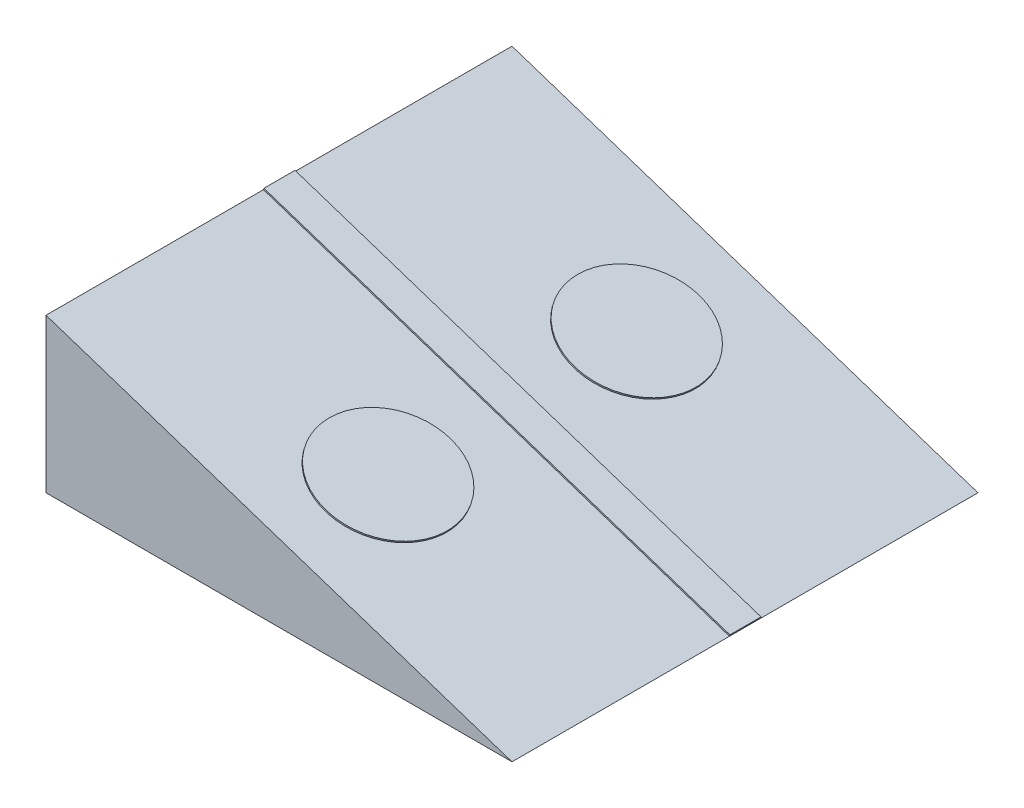
ISO-10303-21;
HEADER;
FILE_DESCRIPTION(('STEP AP214'),'2;1');
FILE_NAME('part.step','',(''),(''),'','','');
FILE_SCHEMA(('AUTOMOTIVE_DESIGN { 1 0 10303 214 1 1 1 1 }'));
ENDSEC;
DATA;
#1=APPLICATION_CONTEXT('core data for automotive mechanical design processes');
#2=APPLICATION_PROTOCOL_DEFINITION('international standard','automotive_design',2000,#1);
#3=PRODUCT_CONTEXT('',#1,'mechanical');
#4=PRODUCT('Part','Part','',(#3));
#5=PRODUCT_RELATED_PRODUCT_CATEGORY('part','',(#4));
#6=PRODUCT_DEFINITION_FORMATION('','',#4);
#7=PRODUCT_DEFINITION_CONTEXT('part definition',#1,'design');
#8=PRODUCT_DEFINITION('design','',#6,#7);
#9=PRODUCT_DEFINITION_SHAPE('','',#8);
#10=(LENGTH_UNIT() NAMED_UNIT(*) SI_UNIT(.MILLI.,.METRE.));
#11=(NAMED_UNIT(*) PLANE_ANGLE_UNIT() SI_UNIT($,.RADIAN.));
#12=(NAMED_UNIT(*) SI_UNIT($,.STERADIAN.) SOLID_ANGLE_UNIT());
#13=UNCERTAINTY_MEASURE_WITH_UNIT(LENGTH_MEASURE(1.E-05),#10,'distance_accuracy_value','');
#14=(GEOMETRIC_REPRESENTATION_CONTEXT(3) GLOBAL_UNCERTAINTY_ASSIGNED_CONTEXT((#13)) GLOBAL_UNIT_ASSIGNED_CONTEXT((#10,
#11,#12)) REPRESENTATION_CONTEXT('',''));
#15=CARTESIAN_POINT('',(0.,0.,0.));
#16=DIRECTION('',(0.,0.,1.));
#17=DIRECTION('',(1.,0.,0.));
#18=AXIS2_PLACEMENT_3D('',#15,#16,#17);
#19=CARTESIAN_POINT('',(0.,99.,-300.));
#20=DIRECTION('',(0.313377454203902,0.949628649102733,0.));
#21=DIRECTION('',(-0.949628649102733,0.313377454203902,0.));
#22=AXIS2_PLACEMENT_3D('',#19,#20,#21);
#23=PLANE('',#22);
#24=CARTESIAN_POINT('',(150.,49.5,-70.));
#25=DIRECTION('',(0.313377454203902,0.949628649102733,0.));
#26=DIRECTION('',(-0.949628649102733,0.313377454203902,0.));
#27=AXIS2_PLACEMENT_3D('',#24,#25,#26);
#28=CIRCLE('',#27,40.);
#29=CARTESIAN_POINT('',(112.014854035891,62.0350981681561,-70.));
#30=VERTEX_POINT('',#29);
#31=EDGE_CURVE('E162',#30,#30,#28,.T.);
#32=ORIENTED_EDGE('',*,*,#31,.F.);
#33=EDGE_LOOP('',(#32));
#34=FACE_BOUND('',#33,.T.);
#35=DIRECTION('',(0.,0.,1.));
#36=VECTOR('',#35,1.);
#37=CARTESIAN_POINT('',(300.,0.,-300.));
#38=LINE('',#37,#36);
#39=CARTESIAN_POINT('',(300.,0.,-140.));
#40=VERTEX_POINT('',#39);
#41=CARTESIAN_POINT('',(300.,0.,0.));
#42=VERTEX_POINT('',#41);
#43=EDGE_CURVE('E192',#40,#42,#38,.T.);
#44=ORIENTED_EDGE('',*,*,#43,.F.);
#45=DIRECTION('',(0.949628649102733,-0.313377454203902,0.));
#46=VECTOR('',#45,1.);
#47=CARTESIAN_POINT('',(29.4616286409956,89.2776625484715,-140.));
#48=LINE('',#47,#46);
#49=CARTESIAN_POINT('',(0.,99.,-140.));
#50=VERTEX_POINT('',#49);
#51=EDGE_CURVE('E157',#50,#40,#48,.T.);
#52=ORIENTED_EDGE('',*,*,#51,.F.);
#53=DIRECTION('',(0.,0.,1.));
#54=VECTOR('',#53,1.);
#55=CARTESIAN_POINT('',(0.,99.,-300.));
#56=LINE('',#55,#54);
#57=CARTESIAN_POINT('',(0.,99.,0.));
#58=VERTEX_POINT('',#57);
#59=EDGE_CURVE('E72',#50,#58,#56,.T.);
#60=ORIENTED_EDGE('',*,*,#59,.T.);
#61=DIRECTION('',(-0.949628649102733,0.313377454203902,0.));
#62=VECTOR('',#61,1.);
#63=CARTESIAN_POINT('',(0.,99.,0.));
#64=LINE('',#63,#62);
#65=EDGE_CURVE('E179',#42,#58,#64,.T.);
#66=ORIENTED_EDGE('',*,*,#65,.F.);
#67=EDGE_LOOP('',(#44,#52,#60,#66));
#68=FACE_BOUND('',#67,.T.);
#69=ADVANCED_FACE('F63',(#34,#68),#23,.T.);
#70=CARTESIAN_POINT('',(0.,0.,-300.));
#71=DIRECTION('',(-1.,0.,0.));
#72=DIRECTION('',(0.,0.,1.));
#73=AXIS2_PLACEMENT_3D('',#70,#71,#72);
#74=PLANE('',#73);
#75=DIRECTION('',(0.,-1.,0.));
#76=VECTOR('',#75,1.);
#77=CARTESIAN_POINT('',(0.,0.,0.));
#78=LINE('',#77,#76);
#79=CARTESIAN_POINT('',(0.,0.,0.));
#80=VERTEX_POINT('',#79);
#81=EDGE_CURVE('E143',#58,#80,#78,.T.);
#82=ORIENTED_EDGE('',*,*,#81,.F.);
#83=ORIENTED_EDGE('',*,*,#59,.F.);
#84=DIRECTION('',(0.,0.,1.));
#85=VECTOR('',#84,1.);
#86=CARTESIAN_POINT('',(0.,99.,0.));
#87=LINE('',#86,#85);
#88=CARTESIAN_POINT('',(0.,99.,-160.));
#89=VERTEX_POINT('',#88);
#90=EDGE_CURVE('E159',#89,#50,#87,.T.);
#91=ORIENTED_EDGE('',*,*,#90,.F.);
#92=CARTESIAN_POINT('',(0.,99.,-300.));
#93=VERTEX_POINT('',#92);
#94=EDGE_CURVE('E12',#93,#89,#56,.T.);
#95=ORIENTED_EDGE('',*,*,#94,.F.);
#96=DIRECTION('',(0.,-1.,0.));
#97=VECTOR('',#96,1.);
#98=CARTESIAN_POINT('',(0.,0.,-300.));
#99=LINE('',#98,#97);
#100=CARTESIAN_POINT('',(0.,0.,-300.));
#101=VERTEX_POINT('',#100);
#102=EDGE_CURVE('E176',#93,#101,#99,.T.);
#103=ORIENTED_EDGE('',*,*,#102,.T.);
#104=DIRECTION('',(0.,0.,1.));
#105=VECTOR('',#104,1.);
#106=CARTESIAN_POINT('',(0.,0.,-300.));
#107=LINE('',#106,#105);
#108=EDGE_CURVE('E67',#101,#80,#107,.T.);
#109=ORIENTED_EDGE('',*,*,#108,.T.);
#110=EDGE_LOOP('',(#82,#83,#91,#95,#103,#109));
#111=FACE_BOUND('',#110,.T.);
#112=ADVANCED_FACE('F65',(#111),#74,.T.);
#113=CARTESIAN_POINT('',(150.,49.5,-230.));
#114=DIRECTION('',(0.313377454203902,0.949628649102733,0.));
#115=DIRECTION('',(-0.949628649102733,0.313377454203902,0.));
#116=AXIS2_PLACEMENT_3D('',#113,#114,#115);
#117=CIRCLE('',#116,40.);
#118=CARTESIAN_POINT('',(112.014854035891,62.0350981681561,-230.));
#119=VERTEX_POINT('',#118);
#120=EDGE_CURVE('E225',#119,#119,#117,.T.);
#121=ORIENTED_EDGE('',*,*,#120,.F.);
#122=EDGE_LOOP('',(#121));
#123=FACE_BOUND('',#122,.T.);
#124=DIRECTION('',(0.949628649102733,-0.313377454203902,0.));
#125=VECTOR('',#124,1.);
#126=CARTESIAN_POINT('',(29.4616286409956,89.2776625484715,-160.));
#127=LINE('',#126,#125);
#128=CARTESIAN_POINT('',(300.,0.,-160.));
#129=VERTEX_POINT('',#128);
#130=EDGE_CURVE('E141',#89,#129,#127,.T.);
#131=ORIENTED_EDGE('',*,*,#130,.T.);
#132=CARTESIAN_POINT('',(300.,0.,-300.));
#133=VERTEX_POINT('',#132);
#134=EDGE_CURVE('E190',#133,#129,#38,.T.);
#135=ORIENTED_EDGE('',*,*,#134,.F.);
#136=DIRECTION('',(-0.949628649102733,0.313377454203902,0.));
#137=VECTOR('',#136,1.);
#138=CARTESIAN_POINT('',(0.,99.,-300.));
#139=LINE('',#138,#137);
#140=EDGE_CURVE('E181',#133,#93,#139,.T.);
#141=ORIENTED_EDGE('',*,*,#140,.T.);
#142=ORIENTED_EDGE('',*,*,#94,.T.);
#143=EDGE_LOOP('',(#131,#135,#141,#142));
#144=FACE_BOUND('',#143,.T.);
#145=ADVANCED_FACE('F200',(#123,#144),#23,.T.);
#146=CARTESIAN_POINT('',(0.,0.,-300.));
#147=DIRECTION('',(0.,-1.,0.));
#148=DIRECTION('',(0.,0.,-1.));
#149=AXIS2_PLACEMENT_3D('',#146,#147,#148);
#150=PLANE('',#149);
#151=DIRECTION('',(1.,0.,0.));
#152=VECTOR('',#151,1.);
#153=CARTESIAN_POINT('',(0.,0.,0.));
#154=LINE('',#153,#152);
#155=EDGE_CURVE('E186',#80,#42,#154,.T.);
#156=ORIENTED_EDGE('',*,*,#155,.F.);
#157=ORIENTED_EDGE('',*,*,#108,.F.);
#158=DIRECTION('',(1.,0.,0.));
#159=VECTOR('',#158,1.);
#160=CARTESIAN_POINT('',(0.,0.,-300.));
#161=LINE('',#160,#159);
#162=EDGE_CURVE('E178',#101,#133,#161,.T.);
#163=ORIENTED_EDGE('',*,*,#162,.T.);
#164=ORIENTED_EDGE('',*,*,#134,.T.);
#165=DIRECTION('',(0.,0.,-1.));
#166=VECTOR('',#165,1.);
#167=CARTESIAN_POINT('',(300.,0.,-140.));
#168=LINE('',#167,#166);
#169=EDGE_CURVE('E171',#40,#129,#168,.T.);
#170=ORIENTED_EDGE('',*,*,#169,.F.);
#171=ORIENTED_EDGE('',*,*,#43,.T.);
#172=EDGE_LOOP('',(#156,#157,#163,#164,#170,#171));
#173=FACE_BOUND('',#172,.T.);
#174=ADVANCED_FACE('F195',(#173),#150,.T.);
#175=CARTESIAN_POINT('',(0.,0.,-300.));
#176=DIRECTION('',(0.,0.,-1.));
#177=DIRECTION('',(-1.,0.,0.));
#178=AXIS2_PLACEMENT_3D('',#175,#176,#177);
#179=PLANE('',#178);
#180=ORIENTED_EDGE('',*,*,#102,.F.);
#181=ORIENTED_EDGE('',*,*,#140,.F.);
#182=ORIENTED_EDGE('',*,*,#162,.F.);
#183=EDGE_LOOP('',(#180,#181,#182));
#184=FACE_BOUND('',#183,.T.);
#185=ADVANCED_FACE('F203',(#184),#179,.T.);
#186=CARTESIAN_POINT('',(0.,0.,0.));
#187=DIRECTION('',(0.,0.,-1.));
#188=DIRECTION('',(-1.,0.,0.));
#189=AXIS2_PLACEMENT_3D('',#186,#187,#188);
#190=PLANE('',#189);
#191=ORIENTED_EDGE('',*,*,#81,.T.);
#192=ORIENTED_EDGE('',*,*,#155,.T.);
#193=ORIENTED_EDGE('',*,*,#65,.T.);
#194=EDGE_LOOP('',(#191,#192,#193));
#195=FACE_BOUND('',#194,.T.);
#196=ADVANCED_FACE('F197',(#195),#190,.F.);
#197=CARTESIAN_POINT('',(29.7750060951995,90.2272911975742,-160.));
#198=DIRECTION('',(0.,0.,-1.));
#199=DIRECTION('',(-1.,0.,0.));
#200=AXIS2_PLACEMENT_3D('',#197,#198,#199);
#201=PLANE('',#200);
#202=ORIENTED_EDGE('',*,*,#130,.F.);
#203=DIRECTION('',(-0.313377454203902,-0.949628649102733,0.));
#204=VECTOR('',#203,1.);
#205=CARTESIAN_POINT('',(0.313377454203898,99.9496286491028,-160.));
#206=LINE('',#205,#204);
#207=CARTESIAN_POINT('',(0.313377454203898,99.9496286491028,-160.));
#208=VERTEX_POINT('',#207);
#209=EDGE_CURVE('E134',#208,#89,#206,.T.);
#210=ORIENTED_EDGE('',*,*,#209,.F.);
#211=DIRECTION('',(0.949628649102733,-0.313377454203902,0.));
#212=VECTOR('',#211,1.);
#213=CARTESIAN_POINT('',(29.7750060951995,90.2272911975742,-160.));
#214=LINE('',#213,#212);
#215=CARTESIAN_POINT('',(300.313377454204,0.949628649102761,-160.));
#216=VERTEX_POINT('',#215);
#217=EDGE_CURVE('E138',#208,#216,#214,.T.);
#218=ORIENTED_EDGE('',*,*,#217,.T.);
#219=DIRECTION('',(-0.313377454203902,-0.949628649102733,0.));
#220=VECTOR('',#219,1.);
#221=CARTESIAN_POINT('',(300.313377454204,0.949628649102761,-160.));
#222=LINE('',#221,#220);
#223=EDGE_CURVE('E170',#216,#129,#222,.T.);
#224=ORIENTED_EDGE('',*,*,#223,.T.);
#225=EDGE_LOOP('',(#202,#210,#218,#224));
#226=FACE_BOUND('',#225,.T.);
#227=ADVANCED_FACE('F136',(#226),#201,.T.);
#228=CARTESIAN_POINT('',(29.7750060951995,90.2272911975742,-140.));
#229=DIRECTION('',(0.,0.,-1.));
#230=DIRECTION('',(-1.,0.,0.));
#231=AXIS2_PLACEMENT_3D('',#228,#229,#230);
#232=PLANE('',#231);
#233=ORIENTED_EDGE('',*,*,#51,.T.);
#234=DIRECTION('',(-0.313377454203902,-0.949628649102733,0.));
#235=VECTOR('',#234,1.);
#236=CARTESIAN_POINT('',(300.313377454204,0.949628649102761,-140.));
#237=LINE('',#236,#235);
#238=CARTESIAN_POINT('',(300.313377454204,0.949628649102761,-140.));
#239=VERTEX_POINT('',#238);
#240=EDGE_CURVE('E80',#239,#40,#237,.T.);
#241=ORIENTED_EDGE('',*,*,#240,.F.);
#242=DIRECTION('',(0.949628649102733,-0.313377454203902,0.));
#243=VECTOR('',#242,1.);
#244=CARTESIAN_POINT('',(29.7750060951995,90.2272911975742,-140.));
#245=LINE('',#244,#243);
#246=CARTESIAN_POINT('',(0.313377454203898,99.9496286491028,-140.));
#247=VERTEX_POINT('',#246);
#248=EDGE_CURVE('E152',#247,#239,#245,.T.);
#249=ORIENTED_EDGE('',*,*,#248,.F.);
#250=DIRECTION('',(-0.313377454203902,-0.949628649102733,0.));
#251=VECTOR('',#250,1.);
#252=CARTESIAN_POINT('',(0.313377454203898,99.9496286491028,-140.));
#253=LINE('',#252,#251);
#254=EDGE_CURVE('E144',#247,#50,#253,.T.);
#255=ORIENTED_EDGE('',*,*,#254,.T.);
#256=EDGE_LOOP('',(#233,#241,#249,#255));
#257=FACE_BOUND('',#256,.T.);
#258=ADVANCED_FACE('F251',(#257),#232,.F.);
#259=CARTESIAN_POINT('',(0.313377454203898,99.9496286491028,0.));
#260=DIRECTION('',(0.949628649102733,-0.313377454203902,0.));
#261=DIRECTION('',(0.313377454203902,0.949628649102733,0.));
#262=AXIS2_PLACEMENT_3D('',#259,#260,#261);
#263=PLANE('',#262);
#264=ORIENTED_EDGE('',*,*,#90,.T.);
#265=ORIENTED_EDGE('',*,*,#254,.F.);
#266=DIRECTION('',(0.,0.,1.));
#267=VECTOR('',#266,1.);
#268=CARTESIAN_POINT('',(0.313377454203898,99.9496286491028,0.));
#269=LINE('',#268,#267);
#270=EDGE_CURVE('E147',#208,#247,#269,.T.);
#271=ORIENTED_EDGE('',*,*,#270,.F.);
#272=ORIENTED_EDGE('',*,*,#209,.T.);
#273=EDGE_LOOP('',(#264,#265,#271,#272));
#274=FACE_BOUND('',#273,.T.);
#275=ADVANCED_FACE('F148',(#274),#263,.F.);
#276=CARTESIAN_POINT('',(29.7750060951995,90.2272911975742,0.));
#277=DIRECTION('',(0.313377454203902,0.949628649102733,0.));
#278=DIRECTION('',(-0.949628649102733,0.313377454203902,0.));
#279=AXIS2_PLACEMENT_3D('',#276,#277,#278);
#280=PLANE('',#279);
#281=ORIENTED_EDGE('',*,*,#248,.T.);
#282=DIRECTION('',(0.,0.,-1.));
#283=VECTOR('',#282,1.);
#284=CARTESIAN_POINT('',(300.313377454204,0.949628649102761,-140.));
#285=LINE('',#284,#283);
#286=EDGE_CURVE('E155',#239,#216,#285,.T.);
#287=ORIENTED_EDGE('',*,*,#286,.T.);
#288=ORIENTED_EDGE('',*,*,#217,.F.);
#289=ORIENTED_EDGE('',*,*,#270,.T.);
#290=EDGE_LOOP('',(#281,#287,#288,#289));
#291=FACE_BOUND('',#290,.T.);
#292=ADVANCED_FACE('F154',(#291),#280,.T.);
#293=CARTESIAN_POINT('',(300.313377454204,0.949628649102761,-140.));
#294=DIRECTION('',(-0.949628649102733,0.313377454203902,0.));
#295=DIRECTION('',(-0.313377454203902,-0.949628649102733,0.));
#296=AXIS2_PLACEMENT_3D('',#293,#294,#295);
#297=PLANE('',#296);
#298=ORIENTED_EDGE('',*,*,#169,.T.);
#299=ORIENTED_EDGE('',*,*,#223,.F.);
#300=ORIENTED_EDGE('',*,*,#286,.F.);
#301=ORIENTED_EDGE('',*,*,#240,.T.);
#302=EDGE_LOOP('',(#298,#299,#300,#301));
#303=FACE_BOUND('',#302,.T.);
#304=ADVANCED_FACE('F198',(#303),#297,.F.);
#305=CARTESIAN_POINT('',(150.313377454204,50.4496286491027,-70.));
#306=DIRECTION('',(-0.313377454203902,-0.949628649102733,0.));
#307=DIRECTION('',(0.949628649102733,-0.313377454203902,0.));
#308=AXIS2_PLACEMENT_3D('',#305,#306,#307);
#309=CYLINDRICAL_SURFACE('',#308,40.);
#310=CARTESIAN_POINT('',(150.313377454204,50.4496286491027,-70.));
#311=DIRECTION('',(0.313377454203902,0.949628649102733,0.));
#312=DIRECTION('',(-0.949628649102733,0.313377454203902,0.));
#313=AXIS2_PLACEMENT_3D('',#310,#311,#312);
#314=CIRCLE('',#313,40.);
#315=CARTESIAN_POINT('',(112.328231490095,62.9847268172588,-70.));
#316=VERTEX_POINT('',#315);
#317=EDGE_CURVE('E173',#316,#316,#314,.T.);
#318=ORIENTED_EDGE('',*,*,#317,.F.);
#319=EDGE_LOOP('',(#318));
#320=FACE_BOUND('',#319,.T.);
#321=ORIENTED_EDGE('',*,*,#31,.T.);
#322=EDGE_LOOP('',(#321));
#323=FACE_BOUND('',#322,.T.);
#324=ADVANCED_FACE('F236',(#320,#323),#309,.T.);
#325=CARTESIAN_POINT('',(29.7750060951995,90.2272911975742,0.));
#326=DIRECTION('',(0.313377454203902,0.949628649102733,0.));
#327=DIRECTION('',(-0.949628649102733,0.313377454203902,0.));
#328=AXIS2_PLACEMENT_3D('',#325,#326,#327);
#329=PLANE('',#328);
#330=ORIENTED_EDGE('',*,*,#317,.T.);
#331=EDGE_LOOP('',(#330));
#332=FACE_BOUND('',#331,.T.);
#333=ADVANCED_FACE('F238',(#332),#329,.T.);
#334=CARTESIAN_POINT('',(150.313377454204,50.4496286491028,-230.));
#335=DIRECTION('',(-0.313377454203902,-0.949628649102733,0.));
#336=DIRECTION('',(0.949628649102733,-0.313377454203902,0.));
#337=AXIS2_PLACEMENT_3D('',#334,#335,#336);
#338=CYLINDRICAL_SURFACE('',#337,40.);
#339=CARTESIAN_POINT('',(150.313377454204,50.4496286491028,-230.));
#340=DIRECTION('',(0.313377454203902,0.949628649102733,0.));
#341=DIRECTION('',(-0.949628649102733,0.313377454203902,0.));
#342=AXIS2_PLACEMENT_3D('',#339,#340,#341);
#343=CIRCLE('',#342,40.);
#344=CARTESIAN_POINT('',(112.328231490095,62.9847268172588,-230.));
#345=VERTEX_POINT('',#344);
#346=EDGE_CURVE('E227',#345,#345,#343,.T.);
#347=ORIENTED_EDGE('',*,*,#346,.F.);
#348=EDGE_LOOP('',(#347));
#349=FACE_BOUND('',#348,.T.);
#350=ORIENTED_EDGE('',*,*,#120,.T.);
#351=EDGE_LOOP('',(#350));
#352=FACE_BOUND('',#351,.T.);
#353=ADVANCED_FACE('F245',(#349,#352),#338,.T.);
#354=CARTESIAN_POINT('',(150.313377454204,50.4496286491028,-230.));
#355=DIRECTION('',(0.313377454203902,0.949628649102733,0.));
#356=DIRECTION('',(-0.949628649102733,0.313377454203902,0.));
#357=AXIS2_PLACEMENT_3D('',#354,#355,#356);
#358=PLANE('',#357);
#359=ORIENTED_EDGE('',*,*,#346,.T.);
#360=EDGE_LOOP('',(#359));
#361=FACE_BOUND('',#360,.T.);
#362=ADVANCED_FACE('F313',(#361),#358,.T.);
#363=CLOSED_SHELL('',(#69,#112,#145,#174,#185,#196,#227,#258,#275,#292,#304,#324,#333,#353,#362));
#364=MANIFOLD_SOLID_BREP('B2',#363);
#365=ADVANCED_BREP_SHAPE_REPRESENTATION('',(#18,#364),#14);
#366=SHAPE_DEFINITION_REPRESENTATION(#9,#365);
ENDSEC;
END-ISO-10303-21;
